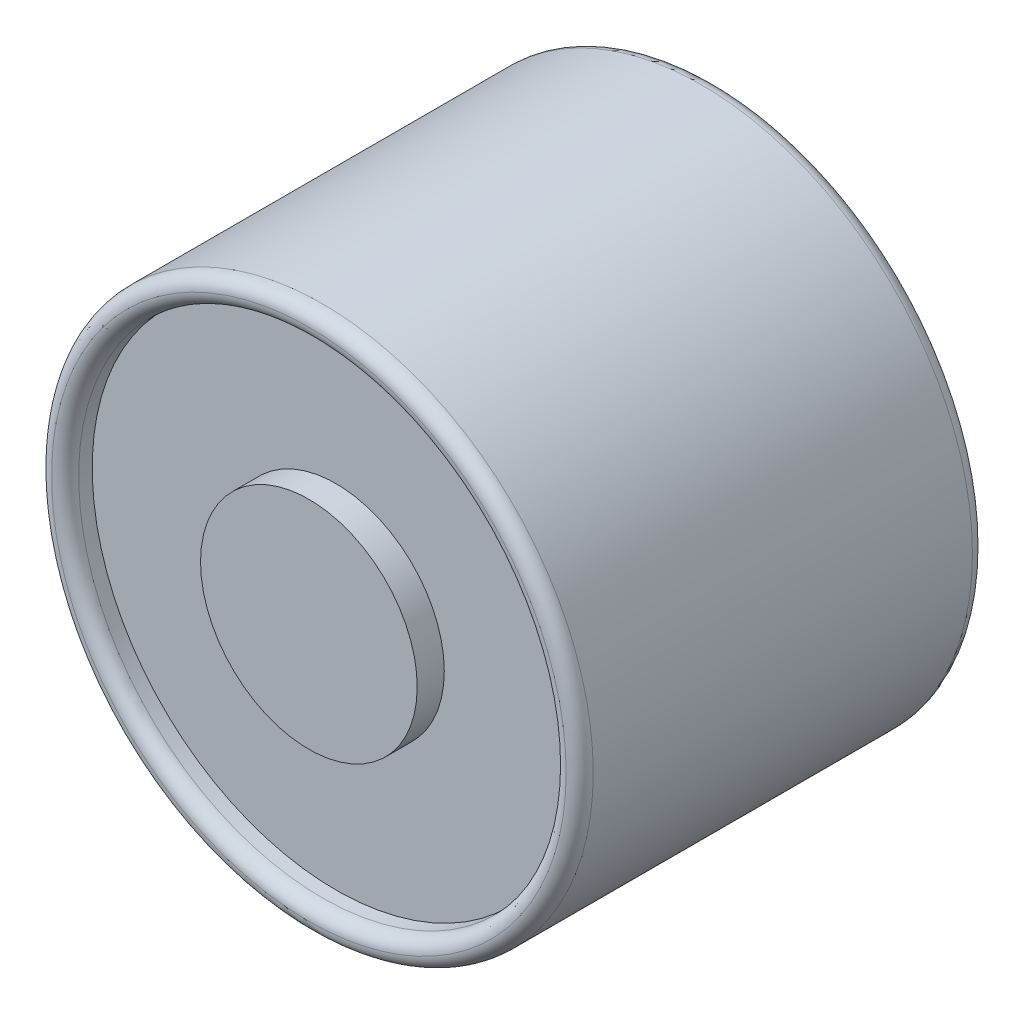
ISO-10303-21;
HEADER;
FILE_DESCRIPTION(('STEP AP214'),'2;1');
FILE_NAME('part.step','',(''),(''),'','','');
FILE_SCHEMA(('AUTOMOTIVE_DESIGN { 1 0 10303 214 1 1 1 1 }'));
ENDSEC;
DATA;
#1=APPLICATION_CONTEXT('core data for automotive mechanical design processes');
#2=APPLICATION_PROTOCOL_DEFINITION('international standard','automotive_design',2000,#1);
#3=PRODUCT_CONTEXT('',#1,'mechanical');
#4=PRODUCT('Part','Part','',(#3));
#5=PRODUCT_RELATED_PRODUCT_CATEGORY('part','',(#4));
#6=PRODUCT_DEFINITION_FORMATION('','',#4);
#7=PRODUCT_DEFINITION_CONTEXT('part definition',#1,'design');
#8=PRODUCT_DEFINITION('design','',#6,#7);
#9=PRODUCT_DEFINITION_SHAPE('','',#8);
#10=(LENGTH_UNIT() NAMED_UNIT(*) SI_UNIT(.MILLI.,.METRE.));
#11=(NAMED_UNIT(*) PLANE_ANGLE_UNIT() SI_UNIT($,.RADIAN.));
#12=(NAMED_UNIT(*) SI_UNIT($,.STERADIAN.) SOLID_ANGLE_UNIT());
#13=UNCERTAINTY_MEASURE_WITH_UNIT(LENGTH_MEASURE(1.E-05),#10,'distance_accuracy_value','');
#14=(GEOMETRIC_REPRESENTATION_CONTEXT(3) GLOBAL_UNCERTAINTY_ASSIGNED_CONTEXT((#13)) GLOBAL_UNIT_ASSIGNED_CONTEXT((#10,
#11,#12)) REPRESENTATION_CONTEXT('',''));
#15=CARTESIAN_POINT('',(0.,0.,0.));
#16=DIRECTION('',(0.,0.,1.));
#17=DIRECTION('',(1.,0.,0.));
#18=AXIS2_PLACEMENT_3D('',#15,#16,#17);
#19=CARTESIAN_POINT('',(0.,0.,15.));
#20=DIRECTION('',(0.,0.,-1.));
#21=DIRECTION('',(-1.,0.,0.));
#22=AXIS2_PLACEMENT_3D('',#19,#20,#21);
#23=CYLINDRICAL_SURFACE('',#22,10.);
#24=CARTESIAN_POINT('',(0.,0.,14.5));
#25=DIRECTION('',(0.,0.,1.));
#26=DIRECTION('',(1.,0.,0.));
#27=AXIS2_PLACEMENT_3D('',#24,#25,#26);
#28=CIRCLE('',#27,10.);
#29=CARTESIAN_POINT('',(10.,0.,14.5));
#30=VERTEX_POINT('',#29);
#31=EDGE_CURVE('E42',#30,#30,#28,.F.);
#32=ORIENTED_EDGE('',*,*,#31,.T.);
#33=EDGE_LOOP('',(#32));
#34=FACE_BOUND('',#33,.T.);
#35=CARTESIAN_POINT('',(0.,0.,0.5));
#36=DIRECTION('',(0.,0.,1.));
#37=DIRECTION('',(1.,0.,0.));
#38=AXIS2_PLACEMENT_3D('',#35,#36,#37);
#39=CIRCLE('',#38,10.);
#40=CARTESIAN_POINT('',(10.,0.,0.5));
#41=VERTEX_POINT('',#40);
#42=EDGE_CURVE('E46',#41,#41,#39,.T.);
#43=ORIENTED_EDGE('',*,*,#42,.T.);
#44=EDGE_LOOP('',(#43));
#45=FACE_BOUND('',#44,.T.);
#46=ADVANCED_FACE('F34',(#34,#45),#23,.T.);
#47=CARTESIAN_POINT('',(0.,0.,0.));
#48=DIRECTION('',(0.,0.,1.));
#49=DIRECTION('',(1.,0.,0.));
#50=AXIS2_PLACEMENT_3D('',#47,#48,#49);
#51=PLANE('',#50);
#52=CARTESIAN_POINT('',(0.,0.,0.));
#53=DIRECTION('',(0.,0.,-1.));
#54=DIRECTION('',(-1.,0.,0.));
#55=AXIS2_PLACEMENT_3D('',#52,#53,#54);
#56=CIRCLE('',#55,2.);
#57=CARTESIAN_POINT('',(-2.,0.,0.));
#58=VERTEX_POINT('',#57);
#59=EDGE_CURVE('E63',#58,#58,#56,.T.);
#60=ORIENTED_EDGE('',*,*,#59,.F.);
#61=EDGE_LOOP('',(#60));
#62=FACE_BOUND('',#61,.T.);
#63=CARTESIAN_POINT('',(0.,0.,0.));
#64=DIRECTION('',(0.,0.,1.));
#65=DIRECTION('',(1.,0.,0.));
#66=AXIS2_PLACEMENT_3D('',#63,#64,#65);
#67=CIRCLE('',#66,9.5);
#68=CARTESIAN_POINT('',(9.5,0.,0.));
#69=VERTEX_POINT('',#68);
#70=EDGE_CURVE('E10',#69,#69,#67,.F.);
#71=ORIENTED_EDGE('',*,*,#70,.T.);
#72=EDGE_LOOP('',(#71));
#73=FACE_BOUND('',#72,.T.);
#74=ADVANCED_FACE('F90',(#62,#73),#51,.F.);
#75=CARTESIAN_POINT('',(0.,0.,14.));
#76=DIRECTION('',(0.,0.,1.));
#77=DIRECTION('',(1.,0.,0.));
#78=AXIS2_PLACEMENT_3D('',#75,#76,#77);
#79=CYLINDRICAL_SURFACE('',#78,9.);
#80=CARTESIAN_POINT('',(0.,0.,14.5));
#81=DIRECTION('',(0.,0.,1.));
#82=DIRECTION('',(1.,0.,0.));
#83=AXIS2_PLACEMENT_3D('',#80,#81,#82);
#84=CIRCLE('',#83,9.);
#85=CARTESIAN_POINT('',(9.,0.,14.5));
#86=VERTEX_POINT('',#85);
#87=EDGE_CURVE('E51',#86,#86,#84,.T.);
#88=ORIENTED_EDGE('',*,*,#87,.T.);
#89=EDGE_LOOP('',(#88));
#90=FACE_BOUND('',#89,.T.);
#91=CARTESIAN_POINT('',(0.,0.,14.));
#92=DIRECTION('',(0.,0.,1.));
#93=DIRECTION('',(1.,0.,0.));
#94=AXIS2_PLACEMENT_3D('',#91,#92,#93);
#95=CIRCLE('',#94,9.);
#96=CARTESIAN_POINT('',(9.,0.,14.));
#97=VERTEX_POINT('',#96);
#98=EDGE_CURVE('E54',#97,#97,#95,.T.);
#99=ORIENTED_EDGE('',*,*,#98,.F.);
#100=EDGE_LOOP('',(#99));
#101=FACE_BOUND('',#100,.T.);
#102=ADVANCED_FACE('F96',(#90,#101),#79,.F.);
#103=CARTESIAN_POINT('',(0.,0.,14.));
#104=DIRECTION('',(0.,0.,1.));
#105=DIRECTION('',(1.,0.,0.));
#106=AXIS2_PLACEMENT_3D('',#103,#104,#105);
#107=PLANE('',#106);
#108=CARTESIAN_POINT('',(0.,0.,14.));
#109=DIRECTION('',(0.,0.,1.));
#110=DIRECTION('',(1.,0.,0.));
#111=AXIS2_PLACEMENT_3D('',#108,#109,#110);
#112=CIRCLE('',#111,4.);
#113=CARTESIAN_POINT('',(4.,0.,14.));
#114=VERTEX_POINT('',#113);
#115=EDGE_CURVE('E57',#114,#114,#112,.T.);
#116=ORIENTED_EDGE('',*,*,#115,.F.);
#117=EDGE_LOOP('',(#116));
#118=FACE_BOUND('',#117,.T.);
#119=ORIENTED_EDGE('',*,*,#98,.T.);
#120=EDGE_LOOP('',(#119));
#121=FACE_BOUND('',#120,.T.);
#122=ADVANCED_FACE('F103',(#118,#121),#107,.T.);
#123=CARTESIAN_POINT('',(0.,0.,14.));
#124=DIRECTION('',(0.,0.,1.));
#125=DIRECTION('',(1.,0.,0.));
#126=AXIS2_PLACEMENT_3D('',#123,#124,#125);
#127=CYLINDRICAL_SURFACE('',#126,4.);
#128=ORIENTED_EDGE('',*,*,#115,.T.);
#129=EDGE_LOOP('',(#128));
#130=FACE_BOUND('',#129,.T.);
#131=CARTESIAN_POINT('',(0.,0.,15.));
#132=DIRECTION('',(0.,0.,1.));
#133=DIRECTION('',(1.,0.,0.));
#134=AXIS2_PLACEMENT_3D('',#131,#132,#133);
#135=CIRCLE('',#134,4.);
#136=CARTESIAN_POINT('',(4.,0.,15.));
#137=VERTEX_POINT('',#136);
#138=EDGE_CURVE('E58',#137,#137,#135,.T.);
#139=ORIENTED_EDGE('',*,*,#138,.F.);
#140=EDGE_LOOP('',(#139));
#141=FACE_BOUND('',#140,.T.);
#142=ADVANCED_FACE('F85',(#130,#141),#127,.T.);
#143=CARTESIAN_POINT('',(0.,0.,15.));
#144=DIRECTION('',(0.,0.,1.));
#145=DIRECTION('',(1.,0.,0.));
#146=AXIS2_PLACEMENT_3D('',#143,#144,#145);
#147=PLANE('',#146);
#148=ORIENTED_EDGE('',*,*,#138,.T.);
#149=EDGE_LOOP('',(#148));
#150=FACE_BOUND('',#149,.T.);
#151=ADVANCED_FACE('F78',(#150),#147,.T.);
#152=CARTESIAN_POINT('',(0.,0.,14.5));
#153=DIRECTION('',(0.,0.,1.));
#154=DIRECTION('',(1.,0.,0.));
#155=AXIS2_PLACEMENT_3D('',#152,#153,#154);
#156=TOROIDAL_SURFACE('',#155,9.5,0.5);
#157=ORIENTED_EDGE('',*,*,#31,.F.);
#158=EDGE_LOOP('',(#157));
#159=FACE_BOUND('',#158,.T.);
#160=CARTESIAN_POINT('',(0.,0.,15.));
#161=DIRECTION('',(0.,0.,1.));
#162=DIRECTION('',(1.,0.,0.));
#163=AXIS2_PLACEMENT_3D('',#160,#161,#162);
#164=CIRCLE('',#163,9.5);
#165=CARTESIAN_POINT('',(9.5,0.,15.));
#166=VERTEX_POINT('',#165);
#167=EDGE_CURVE('E38',#166,#166,#164,.T.);
#168=ORIENTED_EDGE('',*,*,#167,.F.);
#169=EDGE_LOOP('',(#168));
#170=FACE_BOUND('',#169,.T.);
#171=ADVANCED_FACE('F76',(#159,#170),#156,.T.);
#172=CARTESIAN_POINT('',(0.,0.,14.5));
#173=DIRECTION('',(0.,0.,1.));
#174=DIRECTION('',(1.,0.,0.));
#175=AXIS2_PLACEMENT_3D('',#172,#173,#174);
#176=TOROIDAL_SURFACE('',#175,9.5,0.5);
#177=ORIENTED_EDGE('',*,*,#167,.T.);
#178=EDGE_LOOP('',(#177));
#179=FACE_BOUND('',#178,.T.);
#180=ORIENTED_EDGE('',*,*,#87,.F.);
#181=EDGE_LOOP('',(#180));
#182=FACE_BOUND('',#181,.T.);
#183=ADVANCED_FACE('F73',(#179,#182),#176,.T.);
#184=CARTESIAN_POINT('',(0.,0.,0.5));
#185=DIRECTION('',(0.,0.,1.));
#186=DIRECTION('',(1.,0.,0.));
#187=AXIS2_PLACEMENT_3D('',#184,#185,#186);
#188=TOROIDAL_SURFACE('',#187,9.5,0.5);
#189=ORIENTED_EDGE('',*,*,#70,.F.);
#190=EDGE_LOOP('',(#189));
#191=FACE_BOUND('',#190,.T.);
#192=ORIENTED_EDGE('',*,*,#42,.F.);
#193=EDGE_LOOP('',(#192));
#194=FACE_BOUND('',#193,.T.);
#195=ADVANCED_FACE('F36',(#191,#194),#188,.T.);
#196=CARTESIAN_POINT('',(0.,0.,8.));
#197=DIRECTION('',(0.,0.,-1.));
#198=DIRECTION('',(-1.,0.,0.));
#199=AXIS2_PLACEMENT_3D('',#196,#197,#198);
#200=CYLINDRICAL_SURFACE('',#199,2.);
#201=CARTESIAN_POINT('',(0.,0.,8.));
#202=DIRECTION('',(0.,0.,-1.));
#203=DIRECTION('',(-1.,0.,0.));
#204=AXIS2_PLACEMENT_3D('',#201,#202,#203);
#205=CIRCLE('',#204,2.);
#206=CARTESIAN_POINT('',(-2.,0.,8.));
#207=VERTEX_POINT('',#206);
#208=EDGE_CURVE('E66',#207,#207,#205,.T.);
#209=ORIENTED_EDGE('',*,*,#208,.F.);
#210=EDGE_LOOP('',(#209));
#211=FACE_BOUND('',#210,.T.);
#212=ORIENTED_EDGE('',*,*,#59,.T.);
#213=EDGE_LOOP('',(#212));
#214=FACE_BOUND('',#213,.T.);
#215=ADVANCED_FACE('F111',(#211,#214),#200,.F.);
#216=CARTESIAN_POINT('',(0.,0.,8.));
#217=DIRECTION('',(0.,0.,-1.));
#218=DIRECTION('',(-1.,0.,0.));
#219=AXIS2_PLACEMENT_3D('',#216,#217,#218);
#220=PLANE('',#219);
#221=ORIENTED_EDGE('',*,*,#208,.T.);
#222=EDGE_LOOP('',(#221));
#223=FACE_BOUND('',#222,.T.);
#224=ADVANCED_FACE('F114',(#223),#220,.T.);
#225=CLOSED_SHELL('',(#46,#74,#102,#122,#142,#151,#171,#183,#195,#215,#224));
#226=MANIFOLD_SOLID_BREP('B2',#225);
#227=ADVANCED_BREP_SHAPE_REPRESENTATION('',(#18,#226),#14);
#228=SHAPE_DEFINITION_REPRESENTATION(#9,#227);
ENDSEC;
END-ISO-10303-21;
